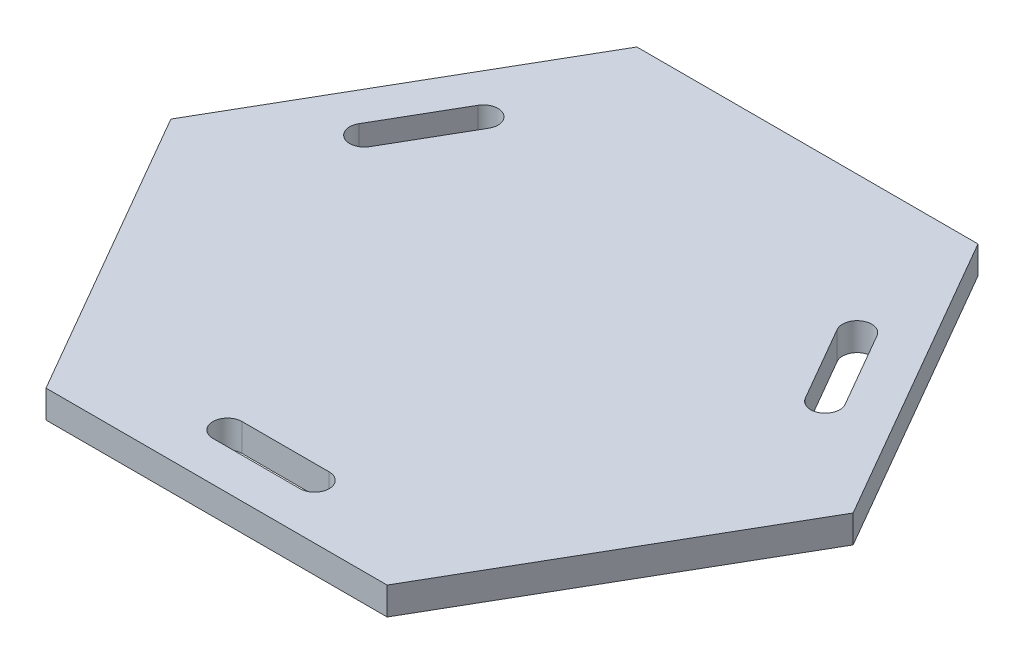
ISO-10303-21;
HEADER;
FILE_DESCRIPTION(('STEP AP214'),'2;1');
FILE_NAME('part.step','',(''),(''),'','','');
FILE_SCHEMA(('AUTOMOTIVE_DESIGN { 1 0 10303 214 1 1 1 1 }'));
ENDSEC;
DATA;
#1=APPLICATION_CONTEXT('core data for automotive mechanical design processes');
#2=APPLICATION_PROTOCOL_DEFINITION('international standard','automotive_design',2000,#1);
#3=PRODUCT_CONTEXT('',#1,'mechanical');
#4=PRODUCT('Part','Part','',(#3));
#5=PRODUCT_RELATED_PRODUCT_CATEGORY('part','',(#4));
#6=PRODUCT_DEFINITION_FORMATION('','',#4);
#7=PRODUCT_DEFINITION_CONTEXT('part definition',#1,'design');
#8=PRODUCT_DEFINITION('design','',#6,#7);
#9=PRODUCT_DEFINITION_SHAPE('','',#8);
#10=(LENGTH_UNIT() NAMED_UNIT(*) SI_UNIT(.MILLI.,.METRE.));
#11=(NAMED_UNIT(*) PLANE_ANGLE_UNIT() SI_UNIT($,.RADIAN.));
#12=(NAMED_UNIT(*) SI_UNIT($,.STERADIAN.) SOLID_ANGLE_UNIT());
#13=UNCERTAINTY_MEASURE_WITH_UNIT(LENGTH_MEASURE(1.E-05),#10,'distance_accuracy_value','');
#14=(GEOMETRIC_REPRESENTATION_CONTEXT(3) GLOBAL_UNCERTAINTY_ASSIGNED_CONTEXT((#13)) GLOBAL_UNIT_ASSIGNED_CONTEXT((#10,
#11,#12)) REPRESENTATION_CONTEXT('',''));
#15=CARTESIAN_POINT('',(0.,0.,0.));
#16=DIRECTION('',(0.,0.,1.));
#17=DIRECTION('',(1.,0.,0.));
#18=AXIS2_PLACEMENT_3D('',#15,#16,#17);
#19=CARTESIAN_POINT('',(-117.317574699332,19.05,-203.2));
#20=DIRECTION('',(0.866025403784439,0.,0.5));
#21=DIRECTION('',(0.5,0.,-0.866025403784438));
#22=AXIS2_PLACEMENT_3D('',#19,#20,#21);
#23=PLANE('',#22);
#24=DIRECTION('',(-0.5,0.,0.866025403784439));
#25=VECTOR('',#24,1.);
#26=CARTESIAN_POINT('',(-117.317574699332,0.,-203.2));
#27=LINE('',#26,#25);
#28=CARTESIAN_POINT('',(-117.317574699332,0.,-203.2));
#29=VERTEX_POINT('',#28);
#30=CARTESIAN_POINT('',(-234.635149398664,0.,0.));
#31=VERTEX_POINT('',#30);
#32=EDGE_CURVE('E251',#29,#31,#27,.T.);
#33=ORIENTED_EDGE('',*,*,#32,.T.);
#34=DIRECTION('',(0.,-1.,0.));
#35=VECTOR('',#34,1.);
#36=CARTESIAN_POINT('',(-234.635149398664,19.05,0.));
#37=LINE('',#36,#35);
#38=CARTESIAN_POINT('',(-234.635149398664,19.05,0.));
#39=VERTEX_POINT('',#38);
#40=EDGE_CURVE('E11',#39,#31,#37,.T.);
#41=ORIENTED_EDGE('',*,*,#40,.F.);
#42=DIRECTION('',(-0.5,0.,0.866025403784439));
#43=VECTOR('',#42,1.);
#44=CARTESIAN_POINT('',(-117.317574699332,19.05,-203.2));
#45=LINE('',#44,#43);
#46=CARTESIAN_POINT('',(-117.317574699332,19.05,-203.2));
#47=VERTEX_POINT('',#46);
#48=EDGE_CURVE('E258',#47,#39,#45,.T.);
#49=ORIENTED_EDGE('',*,*,#48,.F.);
#50=DIRECTION('',(0.,-1.,0.));
#51=VECTOR('',#50,1.);
#52=CARTESIAN_POINT('',(-117.317574699332,19.05,-203.2));
#53=LINE('',#52,#51);
#54=EDGE_CURVE('E272',#47,#29,#53,.T.);
#55=ORIENTED_EDGE('',*,*,#54,.T.);
#56=EDGE_LOOP('',(#33,#41,#49,#55));
#57=FACE_BOUND('',#56,.T.);
#58=ADVANCED_FACE('F33',(#57),#23,.F.);
#59=CARTESIAN_POINT('',(-234.635149398664,19.05,0.));
#60=DIRECTION('',(0.866025403784439,0.,-0.5));
#61=DIRECTION('',(-0.5,0.,-0.866025403784439));
#62=AXIS2_PLACEMENT_3D('',#59,#60,#61);
#63=PLANE('',#62);
#64=DIRECTION('',(0.5,0.,0.866025403784439));
#65=VECTOR('',#64,1.);
#66=CARTESIAN_POINT('',(-234.635149398664,0.,0.));
#67=LINE('',#66,#65);
#68=CARTESIAN_POINT('',(-117.317574699332,0.,203.2));
#69=VERTEX_POINT('',#68);
#70=EDGE_CURVE('E275',#31,#69,#67,.T.);
#71=ORIENTED_EDGE('',*,*,#70,.T.);
#72=DIRECTION('',(0.,-1.,0.));
#73=VECTOR('',#72,1.);
#74=CARTESIAN_POINT('',(-117.317574699332,19.05,203.2));
#75=LINE('',#74,#73);
#76=CARTESIAN_POINT('',(-117.317574699332,19.05,203.2));
#77=VERTEX_POINT('',#76);
#78=EDGE_CURVE('E40',#77,#69,#75,.T.);
#79=ORIENTED_EDGE('',*,*,#78,.F.);
#80=DIRECTION('',(0.5,0.,0.866025403784439));
#81=VECTOR('',#80,1.);
#82=CARTESIAN_POINT('',(-234.635149398664,19.05,0.));
#83=LINE('',#82,#81);
#84=EDGE_CURVE('E261',#39,#77,#83,.T.);
#85=ORIENTED_EDGE('',*,*,#84,.F.);
#86=ORIENTED_EDGE('',*,*,#40,.T.);
#87=EDGE_LOOP('',(#71,#79,#85,#86));
#88=FACE_BOUND('',#87,.T.);
#89=ADVANCED_FACE('F321',(#88),#63,.F.);
#90=CARTESIAN_POINT('',(-117.317574699332,19.05,203.2));
#91=DIRECTION('',(0.,0.,-1.));
#92=DIRECTION('',(-1.,0.,0.));
#93=AXIS2_PLACEMENT_3D('',#90,#91,#92);
#94=PLANE('',#93);
#95=DIRECTION('',(1.,0.,0.));
#96=VECTOR('',#95,1.);
#97=CARTESIAN_POINT('',(-117.317574699332,0.,203.2));
#98=LINE('',#97,#96);
#99=CARTESIAN_POINT('',(117.317574699332,0.,203.2));
#100=VERTEX_POINT('',#99);
#101=EDGE_CURVE('E277',#69,#100,#98,.T.);
#102=ORIENTED_EDGE('',*,*,#101,.T.);
#103=DIRECTION('',(0.,-1.,0.));
#104=VECTOR('',#103,1.);
#105=CARTESIAN_POINT('',(117.317574699332,19.05,203.2));
#106=LINE('',#105,#104);
#107=CARTESIAN_POINT('',(117.317574699332,19.05,203.2));
#108=VERTEX_POINT('',#107);
#109=EDGE_CURVE('E292',#108,#100,#106,.T.);
#110=ORIENTED_EDGE('',*,*,#109,.F.);
#111=DIRECTION('',(1.,0.,0.));
#112=VECTOR('',#111,1.);
#113=CARTESIAN_POINT('',(-117.317574699332,19.05,203.2));
#114=LINE('',#113,#112);
#115=EDGE_CURVE('E264',#77,#108,#114,.T.);
#116=ORIENTED_EDGE('',*,*,#115,.F.);
#117=ORIENTED_EDGE('',*,*,#78,.T.);
#118=EDGE_LOOP('',(#102,#110,#116,#117));
#119=FACE_BOUND('',#118,.T.);
#120=ADVANCED_FACE('F299',(#119),#94,.F.);
#121=CARTESIAN_POINT('',(117.317574699332,19.05,203.2));
#122=DIRECTION('',(-0.866025403784439,0.,-0.5));
#123=DIRECTION('',(-0.5,0.,0.866025403784439));
#124=AXIS2_PLACEMENT_3D('',#121,#122,#123);
#125=PLANE('',#124);
#126=DIRECTION('',(0.5,0.,-0.866025403784439));
#127=VECTOR('',#126,1.);
#128=CARTESIAN_POINT('',(117.317574699332,0.,203.2));
#129=LINE('',#128,#127);
#130=CARTESIAN_POINT('',(234.635149398664,0.,0.));
#131=VERTEX_POINT('',#130);
#132=EDGE_CURVE('E279',#100,#131,#129,.T.);
#133=ORIENTED_EDGE('',*,*,#132,.T.);
#134=DIRECTION('',(0.,-1.,0.));
#135=VECTOR('',#134,1.);
#136=CARTESIAN_POINT('',(234.635149398664,19.05,0.));
#137=LINE('',#136,#135);
#138=CARTESIAN_POINT('',(234.635149398664,19.05,0.));
#139=VERTEX_POINT('',#138);
#140=EDGE_CURVE('E289',#139,#131,#137,.T.);
#141=ORIENTED_EDGE('',*,*,#140,.F.);
#142=DIRECTION('',(0.5,0.,-0.866025403784439));
#143=VECTOR('',#142,1.);
#144=CARTESIAN_POINT('',(117.317574699332,19.05,203.2));
#145=LINE('',#144,#143);
#146=EDGE_CURVE('E266',#108,#139,#145,.T.);
#147=ORIENTED_EDGE('',*,*,#146,.F.);
#148=ORIENTED_EDGE('',*,*,#109,.T.);
#149=EDGE_LOOP('',(#133,#141,#147,#148));
#150=FACE_BOUND('',#149,.T.);
#151=ADVANCED_FACE('F309',(#150),#125,.F.);
#152=CARTESIAN_POINT('',(234.635149398664,19.05,0.));
#153=DIRECTION('',(-0.866025403784439,0.,0.5));
#154=DIRECTION('',(0.5,0.,0.866025403784439));
#155=AXIS2_PLACEMENT_3D('',#152,#153,#154);
#156=PLANE('',#155);
#157=DIRECTION('',(-0.5,0.,-0.866025403784439));
#158=VECTOR('',#157,1.);
#159=CARTESIAN_POINT('',(234.635149398664,0.,0.));
#160=LINE('',#159,#158);
#161=CARTESIAN_POINT('',(117.317574699332,0.,-203.2));
#162=VERTEX_POINT('',#161);
#163=EDGE_CURVE('E281',#131,#162,#160,.T.);
#164=ORIENTED_EDGE('',*,*,#163,.T.);
#165=DIRECTION('',(0.,-1.,0.));
#166=VECTOR('',#165,1.);
#167=CARTESIAN_POINT('',(117.317574699332,19.05,-203.2));
#168=LINE('',#167,#166);
#169=CARTESIAN_POINT('',(117.317574699332,19.05,-203.2));
#170=VERTEX_POINT('',#169);
#171=EDGE_CURVE('E286',#170,#162,#168,.T.);
#172=ORIENTED_EDGE('',*,*,#171,.F.);
#173=DIRECTION('',(-0.5,0.,-0.866025403784439));
#174=VECTOR('',#173,1.);
#175=CARTESIAN_POINT('',(234.635149398664,19.05,0.));
#176=LINE('',#175,#174);
#177=EDGE_CURVE('E268',#139,#170,#176,.T.);
#178=ORIENTED_EDGE('',*,*,#177,.F.);
#179=ORIENTED_EDGE('',*,*,#140,.T.);
#180=EDGE_LOOP('',(#164,#172,#178,#179));
#181=FACE_BOUND('',#180,.T.);
#182=ADVANCED_FACE('F313',(#181),#156,.F.);
#183=CARTESIAN_POINT('',(117.317574699332,19.05,-203.2));
#184=DIRECTION('',(0.,0.,1.));
#185=DIRECTION('',(1.,0.,0.));
#186=AXIS2_PLACEMENT_3D('',#183,#184,#185);
#187=PLANE('',#186);
#188=DIRECTION('',(-1.,0.,0.));
#189=VECTOR('',#188,1.);
#190=CARTESIAN_POINT('',(117.317574699332,0.,-203.2));
#191=LINE('',#190,#189);
#192=EDGE_CURVE('E262',#162,#29,#191,.T.);
#193=ORIENTED_EDGE('',*,*,#192,.T.);
#194=ORIENTED_EDGE('',*,*,#54,.F.);
#195=DIRECTION('',(-1.,0.,0.));
#196=VECTOR('',#195,1.);
#197=CARTESIAN_POINT('',(117.317574699332,19.05,-203.2));
#198=LINE('',#197,#196);
#199=EDGE_CURVE('E270',#170,#47,#198,.T.);
#200=ORIENTED_EDGE('',*,*,#199,.F.);
#201=ORIENTED_EDGE('',*,*,#171,.T.);
#202=EDGE_LOOP('',(#193,#194,#200,#201));
#203=FACE_BOUND('',#202,.T.);
#204=ADVANCED_FACE('F324',(#203),#187,.F.);
#205=CARTESIAN_POINT('',(0.,19.05,0.));
#206=DIRECTION('',(0.,1.,0.));
#207=DIRECTION('',(0.,0.,1.));
#208=AXIS2_PLACEMENT_3D('',#205,#206,#207);
#209=PLANE('',#208);
#210=CARTESIAN_POINT('',(158.516720296214,19.05,-56.9109865977713));
#211=DIRECTION('',(0.,1.,0.));
#212=DIRECTION('',(0.,0.,1.));
#213=AXIS2_PLACEMENT_3D('',#210,#211,#212);
#214=CIRCLE('',#213,10.033);
#215=CARTESIAN_POINT('',(149.827887420045,19.05,-51.8944865977714));
#216=VERTEX_POINT('',#215);
#217=CARTESIAN_POINT('',(167.205553172384,19.05,-61.9274865977712));
#218=VERTEX_POINT('',#217);
#219=EDGE_CURVE('E47',#216,#218,#214,.T.);
#220=ORIENTED_EDGE('',*,*,#219,.F.);
#221=DIRECTION('',(0.499999999999992,0.,0.866025403784443));
#222=VECTOR('',#221,1.);
#223=CARTESIAN_POINT('',(149.827887420045,19.05,-51.8944865977714));
#224=LINE('',#223,#222);
#225=CARTESIAN_POINT('',(119.855887420046,19.05,-103.807513402226));
#226=VERTEX_POINT('',#225);
#227=EDGE_CURVE('E175',#226,#216,#224,.T.);
#228=ORIENTED_EDGE('',*,*,#227,.F.);
#229=CARTESIAN_POINT('',(128.544720296215,19.05,-108.824013402226));
#230=DIRECTION('',(0.,1.,0.));
#231=DIRECTION('',(0.,0.,1.));
#232=AXIS2_PLACEMENT_3D('',#229,#230,#231);
#233=CIRCLE('',#232,10.033);
#234=CARTESIAN_POINT('',(137.233553172384,19.05,-113.840513402226));
#235=VERTEX_POINT('',#234);
#236=EDGE_CURVE('E178',#235,#226,#233,.T.);
#237=ORIENTED_EDGE('',*,*,#236,.F.);
#238=DIRECTION('',(-0.499999999999992,0.,-0.866025403784444));
#239=VECTOR('',#238,1.);
#240=CARTESIAN_POINT('',(167.205553172384,19.05,-61.9274865977712));
#241=LINE('',#240,#239);
#242=EDGE_CURVE('E184',#218,#235,#241,.T.);
#243=ORIENTED_EDGE('',*,*,#242,.F.);
#244=EDGE_LOOP('',(#220,#228,#237,#243));
#245=FACE_BOUND('',#244,.T.);
#246=CARTESIAN_POINT('',(-128.544720296214,19.05,-108.824013402228));
#247=DIRECTION('',(0.,1.,0.));
#248=DIRECTION('',(0.,0.,1.));
#249=AXIS2_PLACEMENT_3D('',#246,#247,#248);
#250=CIRCLE('',#249,10.033);
#251=CARTESIAN_POINT('',(-119.855887420044,19.05,-103.807513402228));
#252=VERTEX_POINT('',#251);
#253=CARTESIAN_POINT('',(-137.233553172383,19.05,-113.840513402228));
#254=VERTEX_POINT('',#253);
#255=EDGE_CURVE('E190',#252,#254,#250,.T.);
#256=ORIENTED_EDGE('',*,*,#255,.F.);
#257=DIRECTION('',(0.500000000000004,0.,-0.866025403784436));
#258=VECTOR('',#257,1.);
#259=CARTESIAN_POINT('',(-119.855887420044,19.05,-103.807513402228));
#260=LINE('',#259,#258);
#261=CARTESIAN_POINT('',(-149.827887420044,19.05,-51.8944865977735));
#262=VERTEX_POINT('',#261);
#263=EDGE_CURVE('E198',#262,#252,#260,.T.);
#264=ORIENTED_EDGE('',*,*,#263,.F.);
#265=CARTESIAN_POINT('',(-158.516720296214,19.05,-56.9109865977736));
#266=DIRECTION('',(0.,1.,0.));
#267=DIRECTION('',(0.,0.,1.));
#268=AXIS2_PLACEMENT_3D('',#265,#266,#267);
#269=CIRCLE('',#268,10.033);
#270=CARTESIAN_POINT('',(-167.205553172383,19.05,-61.9274865977736));
#271=VERTEX_POINT('',#270);
#272=EDGE_CURVE('E212',#271,#262,#269,.T.);
#273=ORIENTED_EDGE('',*,*,#272,.F.);
#274=DIRECTION('',(-0.500000000000004,0.,0.866025403784437));
#275=VECTOR('',#274,1.);
#276=CARTESIAN_POINT('',(-137.233553172383,19.05,-113.840513402228));
#277=LINE('',#276,#275);
#278=EDGE_CURVE('E209',#254,#271,#277,.T.);
#279=ORIENTED_EDGE('',*,*,#278,.F.);
#280=EDGE_LOOP('',(#256,#264,#273,#279));
#281=FACE_BOUND('',#280,.T.);
#282=CARTESIAN_POINT('',(-29.972,19.05,165.735));
#283=DIRECTION('',(0.,1.,0.));
#284=DIRECTION('',(0.,0.,1.));
#285=AXIS2_PLACEMENT_3D('',#282,#283,#284);
#286=CIRCLE('',#285,10.033);
#287=CARTESIAN_POINT('',(-29.972,19.05,155.702));
#288=VERTEX_POINT('',#287);
#289=CARTESIAN_POINT('',(-29.972,19.05,175.768));
#290=VERTEX_POINT('',#289);
#291=EDGE_CURVE('E219',#288,#290,#286,.T.);
#292=ORIENTED_EDGE('',*,*,#291,.F.);
#293=DIRECTION('',(-1.,0.,0.));
#294=VECTOR('',#293,1.);
#295=CARTESIAN_POINT('',(-29.972,19.05,155.702));
#296=LINE('',#295,#294);
#297=CARTESIAN_POINT('',(29.972,19.05,155.702));
#298=VERTEX_POINT('',#297);
#299=EDGE_CURVE('E230',#298,#288,#296,.T.);
#300=ORIENTED_EDGE('',*,*,#299,.F.);
#301=CARTESIAN_POINT('',(29.972,19.05,165.735));
#302=DIRECTION('',(0.,1.,0.));
#303=DIRECTION('',(0.,0.,1.));
#304=AXIS2_PLACEMENT_3D('',#301,#302,#303);
#305=CIRCLE('',#304,10.033);
#306=CARTESIAN_POINT('',(29.972,19.05,175.768));
#307=VERTEX_POINT('',#306);
#308=EDGE_CURVE('E244',#307,#298,#305,.T.);
#309=ORIENTED_EDGE('',*,*,#308,.F.);
#310=DIRECTION('',(1.,0.,0.));
#311=VECTOR('',#310,1.);
#312=CARTESIAN_POINT('',(-29.972,19.05,175.768));
#313=LINE('',#312,#311);
#314=EDGE_CURVE('E241',#290,#307,#313,.T.);
#315=ORIENTED_EDGE('',*,*,#314,.F.);
#316=EDGE_LOOP('',(#292,#300,#309,#315));
#317=FACE_BOUND('',#316,.T.);
#318=ORIENTED_EDGE('',*,*,#48,.T.);
#319=ORIENTED_EDGE('',*,*,#84,.T.);
#320=ORIENTED_EDGE('',*,*,#115,.T.);
#321=ORIENTED_EDGE('',*,*,#146,.T.);
#322=ORIENTED_EDGE('',*,*,#177,.T.);
#323=ORIENTED_EDGE('',*,*,#199,.T.);
#324=EDGE_LOOP('',(#318,#319,#320,#321,#322,#323));
#325=FACE_BOUND('',#324,.T.);
#326=ADVANCED_FACE('F317',(#245,#281,#317,#325),#209,.T.);
#327=CARTESIAN_POINT('',(0.,0.,0.));
#328=DIRECTION('',(0.,1.,0.));
#329=DIRECTION('',(0.,0.,1.));
#330=AXIS2_PLACEMENT_3D('',#327,#328,#329);
#331=PLANE('',#330);
#332=DIRECTION('',(0.499999999999992,0.,0.866025403784443));
#333=VECTOR('',#332,1.);
#334=CARTESIAN_POINT('',(149.827887420045,0.,-51.8944865977714));
#335=LINE('',#334,#333);
#336=CARTESIAN_POINT('',(119.855887420046,0.,-103.807513402226));
#337=VERTEX_POINT('',#336);
#338=CARTESIAN_POINT('',(149.827887420045,0.,-51.8944865977714));
#339=VERTEX_POINT('',#338);
#340=EDGE_CURVE('E165',#337,#339,#335,.T.);
#341=ORIENTED_EDGE('',*,*,#340,.T.);
#342=CARTESIAN_POINT('',(158.516720296214,0.,-56.9109865977713));
#343=DIRECTION('',(0.,1.,0.));
#344=DIRECTION('',(0.,0.,1.));
#345=AXIS2_PLACEMENT_3D('',#342,#343,#344);
#346=CIRCLE('',#345,10.033);
#347=CARTESIAN_POINT('',(167.205553172384,0.,-61.9274865977712));
#348=VERTEX_POINT('',#347);
#349=EDGE_CURVE('E159',#339,#348,#346,.T.);
#350=ORIENTED_EDGE('',*,*,#349,.T.);
#351=DIRECTION('',(-0.499999999999992,0.,-0.866025403784444));
#352=VECTOR('',#351,1.);
#353=CARTESIAN_POINT('',(167.205553172384,0.,-61.9274865977712));
#354=LINE('',#353,#352);
#355=CARTESIAN_POINT('',(137.233553172384,0.,-113.840513402226));
#356=VERTEX_POINT('',#355);
#357=EDGE_CURVE('E168',#348,#356,#354,.T.);
#358=ORIENTED_EDGE('',*,*,#357,.T.);
#359=CARTESIAN_POINT('',(128.544720296215,0.,-108.824013402226));
#360=DIRECTION('',(0.,1.,0.));
#361=DIRECTION('',(0.,0.,1.));
#362=AXIS2_PLACEMENT_3D('',#359,#360,#361);
#363=CIRCLE('',#362,10.033);
#364=EDGE_CURVE('E55',#356,#337,#363,.T.);
#365=ORIENTED_EDGE('',*,*,#364,.T.);
#366=EDGE_LOOP('',(#341,#350,#358,#365));
#367=FACE_BOUND('',#366,.T.);
#368=DIRECTION('',(0.500000000000004,0.,-0.866025403784436));
#369=VECTOR('',#368,1.);
#370=CARTESIAN_POINT('',(-119.855887420044,0.,-103.807513402228));
#371=LINE('',#370,#369);
#372=CARTESIAN_POINT('',(-149.827887420044,0.,-51.8944865977735));
#373=VERTEX_POINT('',#372);
#374=CARTESIAN_POINT('',(-119.855887420044,0.,-103.807513402228));
#375=VERTEX_POINT('',#374);
#376=EDGE_CURVE('E204',#373,#375,#371,.T.);
#377=ORIENTED_EDGE('',*,*,#376,.T.);
#378=CARTESIAN_POINT('',(-128.544720296214,0.,-108.824013402228));
#379=DIRECTION('',(0.,1.,0.));
#380=DIRECTION('',(0.,0.,1.));
#381=AXIS2_PLACEMENT_3D('',#378,#379,#380);
#382=CIRCLE('',#381,10.033);
#383=CARTESIAN_POINT('',(-137.233553172383,0.,-113.840513402228));
#384=VERTEX_POINT('',#383);
#385=EDGE_CURVE('E194',#375,#384,#382,.T.);
#386=ORIENTED_EDGE('',*,*,#385,.T.);
#387=DIRECTION('',(-0.500000000000004,0.,0.866025403784437));
#388=VECTOR('',#387,1.);
#389=CARTESIAN_POINT('',(-137.233553172383,0.,-113.840513402228));
#390=LINE('',#389,#388);
#391=CARTESIAN_POINT('',(-167.205553172383,0.,-61.9274865977736));
#392=VERTEX_POINT('',#391);
#393=EDGE_CURVE('E197',#384,#392,#390,.T.);
#394=ORIENTED_EDGE('',*,*,#393,.T.);
#395=CARTESIAN_POINT('',(-158.516720296214,0.,-56.9109865977736));
#396=DIRECTION('',(0.,1.,0.));
#397=DIRECTION('',(0.,0.,1.));
#398=AXIS2_PLACEMENT_3D('',#395,#396,#397);
#399=CIRCLE('',#398,10.033);
#400=EDGE_CURVE('E201',#392,#373,#399,.T.);
#401=ORIENTED_EDGE('',*,*,#400,.T.);
#402=EDGE_LOOP('',(#377,#386,#394,#401));
#403=FACE_BOUND('',#402,.T.);
#404=DIRECTION('',(-1.,0.,0.));
#405=VECTOR('',#404,1.);
#406=CARTESIAN_POINT('',(-29.972,0.,155.702));
#407=LINE('',#406,#405);
#408=CARTESIAN_POINT('',(29.972,0.,155.702));
#409=VERTEX_POINT('',#408);
#410=CARTESIAN_POINT('',(-29.972,0.,155.702));
#411=VERTEX_POINT('',#410);
#412=EDGE_CURVE('E236',#409,#411,#407,.T.);
#413=ORIENTED_EDGE('',*,*,#412,.T.);
#414=CARTESIAN_POINT('',(-29.972,0.,165.735));
#415=DIRECTION('',(0.,1.,0.));
#416=DIRECTION('',(0.,0.,1.));
#417=AXIS2_PLACEMENT_3D('',#414,#415,#416);
#418=CIRCLE('',#417,10.033);
#419=CARTESIAN_POINT('',(-29.972,0.,175.768));
#420=VERTEX_POINT('',#419);
#421=EDGE_CURVE('E226',#411,#420,#418,.T.);
#422=ORIENTED_EDGE('',*,*,#421,.T.);
#423=DIRECTION('',(1.,0.,0.));
#424=VECTOR('',#423,1.);
#425=CARTESIAN_POINT('',(-29.972,0.,175.768));
#426=LINE('',#425,#424);
#427=CARTESIAN_POINT('',(29.972,0.,175.768));
#428=VERTEX_POINT('',#427);
#429=EDGE_CURVE('E229',#420,#428,#426,.T.);
#430=ORIENTED_EDGE('',*,*,#429,.T.);
#431=CARTESIAN_POINT('',(29.972,0.,165.735));
#432=DIRECTION('',(0.,1.,0.));
#433=DIRECTION('',(0.,0.,1.));
#434=AXIS2_PLACEMENT_3D('',#431,#432,#433);
#435=CIRCLE('',#434,10.033);
#436=EDGE_CURVE('E233',#428,#409,#435,.T.);
#437=ORIENTED_EDGE('',*,*,#436,.T.);
#438=EDGE_LOOP('',(#413,#422,#430,#437));
#439=FACE_BOUND('',#438,.T.);
#440=ORIENTED_EDGE('',*,*,#32,.F.);
#441=ORIENTED_EDGE('',*,*,#192,.F.);
#442=ORIENTED_EDGE('',*,*,#163,.F.);
#443=ORIENTED_EDGE('',*,*,#132,.F.);
#444=ORIENTED_EDGE('',*,*,#101,.F.);
#445=ORIENTED_EDGE('',*,*,#70,.F.);
#446=EDGE_LOOP('',(#440,#441,#442,#443,#444,#445));
#447=FACE_BOUND('',#446,.T.);
#448=ADVANCED_FACE('F172',(#367,#403,#439,#447),#331,.F.);
#449=CARTESIAN_POINT('',(-29.972,0.,165.735));
#450=DIRECTION('',(0.,1.,0.));
#451=DIRECTION('',(0.,0.,1.));
#452=AXIS2_PLACEMENT_3D('',#449,#450,#451);
#453=CYLINDRICAL_SURFACE('',#452,10.033);
#454=ORIENTED_EDGE('',*,*,#291,.T.);
#455=DIRECTION('',(0.,1.,0.));
#456=VECTOR('',#455,1.);
#457=CARTESIAN_POINT('',(-29.972,0.,175.768));
#458=LINE('',#457,#456);
#459=EDGE_CURVE('E239',#420,#290,#458,.T.);
#460=ORIENTED_EDGE('',*,*,#459,.F.);
#461=ORIENTED_EDGE('',*,*,#421,.F.);
#462=DIRECTION('',(0.,1.,0.));
#463=VECTOR('',#462,1.);
#464=CARTESIAN_POINT('',(-29.972,0.,155.702));
#465=LINE('',#464,#463);
#466=EDGE_CURVE('E249',#411,#288,#465,.T.);
#467=ORIENTED_EDGE('',*,*,#466,.T.);
#468=EDGE_LOOP('',(#454,#460,#461,#467));
#469=FACE_BOUND('',#468,.T.);
#470=ADVANCED_FACE('F369',(#469),#453,.F.);
#471=CARTESIAN_POINT('',(-29.972,0.,155.702));
#472=DIRECTION('',(0.,0.,-1.));
#473=DIRECTION('',(-1.,0.,0.));
#474=AXIS2_PLACEMENT_3D('',#471,#472,#473);
#475=PLANE('',#474);
#476=ORIENTED_EDGE('',*,*,#299,.T.);
#477=ORIENTED_EDGE('',*,*,#466,.F.);
#478=ORIENTED_EDGE('',*,*,#412,.F.);
#479=DIRECTION('',(0.,1.,0.));
#480=VECTOR('',#479,1.);
#481=CARTESIAN_POINT('',(29.972,0.,155.702));
#482=LINE('',#481,#480);
#483=EDGE_CURVE('E252',#409,#298,#482,.T.);
#484=ORIENTED_EDGE('',*,*,#483,.T.);
#485=EDGE_LOOP('',(#476,#477,#478,#484));
#486=FACE_BOUND('',#485,.T.);
#487=ADVANCED_FACE('F376',(#486),#475,.F.);
#488=CARTESIAN_POINT('',(29.972,0.,165.735));
#489=DIRECTION('',(0.,1.,0.));
#490=DIRECTION('',(0.,0.,1.));
#491=AXIS2_PLACEMENT_3D('',#488,#489,#490);
#492=CYLINDRICAL_SURFACE('',#491,10.033);
#493=ORIENTED_EDGE('',*,*,#308,.T.);
#494=ORIENTED_EDGE('',*,*,#483,.F.);
#495=ORIENTED_EDGE('',*,*,#436,.F.);
#496=DIRECTION('',(0.,1.,0.));
#497=VECTOR('',#496,1.);
#498=CARTESIAN_POINT('',(29.972,0.,175.768));
#499=LINE('',#498,#497);
#500=EDGE_CURVE('E254',#428,#307,#499,.T.);
#501=ORIENTED_EDGE('',*,*,#500,.T.);
#502=EDGE_LOOP('',(#493,#494,#495,#501));
#503=FACE_BOUND('',#502,.T.);
#504=ADVANCED_FACE('F386',(#503),#492,.F.);
#505=CARTESIAN_POINT('',(-29.972,0.,175.768));
#506=DIRECTION('',(0.,0.,1.));
#507=DIRECTION('',(1.,0.,0.));
#508=AXIS2_PLACEMENT_3D('',#505,#506,#507);
#509=PLANE('',#508);
#510=ORIENTED_EDGE('',*,*,#314,.T.);
#511=ORIENTED_EDGE('',*,*,#500,.F.);
#512=ORIENTED_EDGE('',*,*,#429,.F.);
#513=ORIENTED_EDGE('',*,*,#459,.T.);
#514=EDGE_LOOP('',(#510,#511,#512,#513));
#515=FACE_BOUND('',#514,.T.);
#516=ADVANCED_FACE('F396',(#515),#509,.F.);
#517=CARTESIAN_POINT('',(-128.544720296214,0.,-108.824013402228));
#518=DIRECTION('',(0.,1.,0.));
#519=DIRECTION('',(0.,0.,1.));
#520=AXIS2_PLACEMENT_3D('',#517,#518,#519);
#521=CYLINDRICAL_SURFACE('',#520,10.033);
#522=ORIENTED_EDGE('',*,*,#255,.T.);
#523=DIRECTION('',(0.,1.,0.));
#524=VECTOR('',#523,1.);
#525=CARTESIAN_POINT('',(-137.233553172383,0.,-113.840513402228));
#526=LINE('',#525,#524);
#527=EDGE_CURVE('E207',#384,#254,#526,.T.);
#528=ORIENTED_EDGE('',*,*,#527,.F.);
#529=ORIENTED_EDGE('',*,*,#385,.F.);
#530=DIRECTION('',(0.,1.,0.));
#531=VECTOR('',#530,1.);
#532=CARTESIAN_POINT('',(-119.855887420044,0.,-103.807513402228));
#533=LINE('',#532,#531);
#534=EDGE_CURVE('E217',#375,#252,#533,.T.);
#535=ORIENTED_EDGE('',*,*,#534,.T.);
#536=EDGE_LOOP('',(#522,#528,#529,#535));
#537=FACE_BOUND('',#536,.T.);
#538=ADVANCED_FACE('F406',(#537),#521,.F.);
#539=CARTESIAN_POINT('',(-119.855887420044,0.,-103.807513402228));
#540=DIRECTION('',(0.866025403784436,0.,0.500000000000004));
#541=DIRECTION('',(0.500000000000004,0.,-0.866025403784436));
#542=AXIS2_PLACEMENT_3D('',#539,#540,#541);
#543=PLANE('',#542);
#544=ORIENTED_EDGE('',*,*,#263,.T.);
#545=ORIENTED_EDGE('',*,*,#534,.F.);
#546=ORIENTED_EDGE('',*,*,#376,.F.);
#547=DIRECTION('',(0.,1.,0.));
#548=VECTOR('',#547,1.);
#549=CARTESIAN_POINT('',(-149.827887420044,0.,-51.8944865977735));
#550=LINE('',#549,#548);
#551=EDGE_CURVE('E220',#373,#262,#550,.T.);
#552=ORIENTED_EDGE('',*,*,#551,.T.);
#553=EDGE_LOOP('',(#544,#545,#546,#552));
#554=FACE_BOUND('',#553,.T.);
#555=ADVANCED_FACE('F416',(#554),#543,.F.);
#556=CARTESIAN_POINT('',(-158.516720296214,0.,-56.9109865977736));
#557=DIRECTION('',(0.,1.,0.));
#558=DIRECTION('',(0.,0.,1.));
#559=AXIS2_PLACEMENT_3D('',#556,#557,#558);
#560=CYLINDRICAL_SURFACE('',#559,10.033);
#561=ORIENTED_EDGE('',*,*,#272,.T.);
#562=ORIENTED_EDGE('',*,*,#551,.F.);
#563=ORIENTED_EDGE('',*,*,#400,.F.);
#564=DIRECTION('',(0.,1.,0.));
#565=VECTOR('',#564,1.);
#566=CARTESIAN_POINT('',(-167.205553172383,0.,-61.9274865977736));
#567=LINE('',#566,#565);
#568=EDGE_CURVE('E222',#392,#271,#567,.T.);
#569=ORIENTED_EDGE('',*,*,#568,.T.);
#570=EDGE_LOOP('',(#561,#562,#563,#569));
#571=FACE_BOUND('',#570,.T.);
#572=ADVANCED_FACE('F426',(#571),#560,.F.);
#573=CARTESIAN_POINT('',(-137.233553172383,0.,-113.840513402228));
#574=DIRECTION('',(-0.866025403784436,0.,-0.500000000000004));
#575=DIRECTION('',(-0.500000000000004,0.,0.866025403784437));
#576=AXIS2_PLACEMENT_3D('',#573,#574,#575);
#577=PLANE('',#576);
#578=ORIENTED_EDGE('',*,*,#278,.T.);
#579=ORIENTED_EDGE('',*,*,#568,.F.);
#580=ORIENTED_EDGE('',*,*,#393,.F.);
#581=ORIENTED_EDGE('',*,*,#527,.T.);
#582=EDGE_LOOP('',(#578,#579,#580,#581));
#583=FACE_BOUND('',#582,.T.);
#584=ADVANCED_FACE('F436',(#583),#577,.F.);
#585=CARTESIAN_POINT('',(158.516720296214,0.,-56.9109865977713));
#586=DIRECTION('',(0.,1.,0.));
#587=DIRECTION('',(0.,0.,1.));
#588=AXIS2_PLACEMENT_3D('',#585,#586,#587);
#589=CYLINDRICAL_SURFACE('',#588,10.033);
#590=ORIENTED_EDGE('',*,*,#219,.T.);
#591=DIRECTION('',(0.,1.,0.));
#592=VECTOR('',#591,1.);
#593=CARTESIAN_POINT('',(167.205553172384,0.,-61.9274865977712));
#594=LINE('',#593,#592);
#595=EDGE_CURVE('E155',#348,#218,#594,.T.);
#596=ORIENTED_EDGE('',*,*,#595,.F.);
#597=ORIENTED_EDGE('',*,*,#349,.F.);
#598=DIRECTION('',(0.,1.,0.));
#599=VECTOR('',#598,1.);
#600=CARTESIAN_POINT('',(149.827887420045,0.,-51.8944865977714));
#601=LINE('',#600,#599);
#602=EDGE_CURVE('E188',#339,#216,#601,.T.);
#603=ORIENTED_EDGE('',*,*,#602,.T.);
#604=EDGE_LOOP('',(#590,#596,#597,#603));
#605=FACE_BOUND('',#604,.T.);
#606=ADVANCED_FACE('F157',(#605),#589,.F.);
#607=CARTESIAN_POINT('',(149.827887420045,0.,-51.8944865977714));
#608=DIRECTION('',(-0.866025403784443,0.,0.499999999999992));
#609=DIRECTION('',(0.499999999999992,0.,0.866025403784443));
#610=AXIS2_PLACEMENT_3D('',#607,#608,#609);
#611=PLANE('',#610);
#612=ORIENTED_EDGE('',*,*,#227,.T.);
#613=ORIENTED_EDGE('',*,*,#602,.F.);
#614=ORIENTED_EDGE('',*,*,#340,.F.);
#615=DIRECTION('',(0.,1.,0.));
#616=VECTOR('',#615,1.);
#617=CARTESIAN_POINT('',(119.855887420046,0.,-103.807513402226));
#618=LINE('',#617,#616);
#619=EDGE_CURVE('E191',#337,#226,#618,.T.);
#620=ORIENTED_EDGE('',*,*,#619,.T.);
#621=EDGE_LOOP('',(#612,#613,#614,#620));
#622=FACE_BOUND('',#621,.T.);
#623=ADVANCED_FACE('F455',(#622),#611,.F.);
#624=CARTESIAN_POINT('',(128.544720296215,0.,-108.824013402226));
#625=DIRECTION('',(0.,1.,0.));
#626=DIRECTION('',(0.,0.,1.));
#627=AXIS2_PLACEMENT_3D('',#624,#625,#626);
#628=CYLINDRICAL_SURFACE('',#627,10.033);
#629=ORIENTED_EDGE('',*,*,#236,.T.);
#630=ORIENTED_EDGE('',*,*,#619,.F.);
#631=ORIENTED_EDGE('',*,*,#364,.F.);
#632=DIRECTION('',(0.,1.,0.));
#633=VECTOR('',#632,1.);
#634=CARTESIAN_POINT('',(137.233553172384,0.,-113.840513402226));
#635=LINE('',#634,#633);
#636=EDGE_CURVE('E164',#356,#235,#635,.T.);
#637=ORIENTED_EDGE('',*,*,#636,.T.);
#638=EDGE_LOOP('',(#629,#630,#631,#637));
#639=FACE_BOUND('',#638,.T.);
#640=ADVANCED_FACE('F464',(#639),#628,.F.);
#641=CARTESIAN_POINT('',(167.205553172384,0.,-61.9274865977712));
#642=DIRECTION('',(0.866025403784443,0.,-0.499999999999992));
#643=DIRECTION('',(-0.499999999999992,0.,-0.866025403784443));
#644=AXIS2_PLACEMENT_3D('',#641,#642,#643);
#645=PLANE('',#644);
#646=ORIENTED_EDGE('',*,*,#242,.T.);
#647=ORIENTED_EDGE('',*,*,#636,.F.);
#648=ORIENTED_EDGE('',*,*,#357,.F.);
#649=ORIENTED_EDGE('',*,*,#595,.T.);
#650=EDGE_LOOP('',(#646,#647,#648,#649));
#651=FACE_BOUND('',#650,.T.);
#652=ADVANCED_FACE('F169',(#651),#645,.F.);
#653=CLOSED_SHELL('',(#58,#89,#120,#151,#182,#204,#326,#448,#470,#487,#504,#516,#538,#555,#572,
#584,#606,#623,#640,#652));
#654=MANIFOLD_SOLID_BREP('B2',#653);
#655=ADVANCED_BREP_SHAPE_REPRESENTATION('',(#18,#654),#14);
#656=SHAPE_DEFINITION_REPRESENTATION(#9,#655);
ENDSEC;
END-ISO-10303-21;
